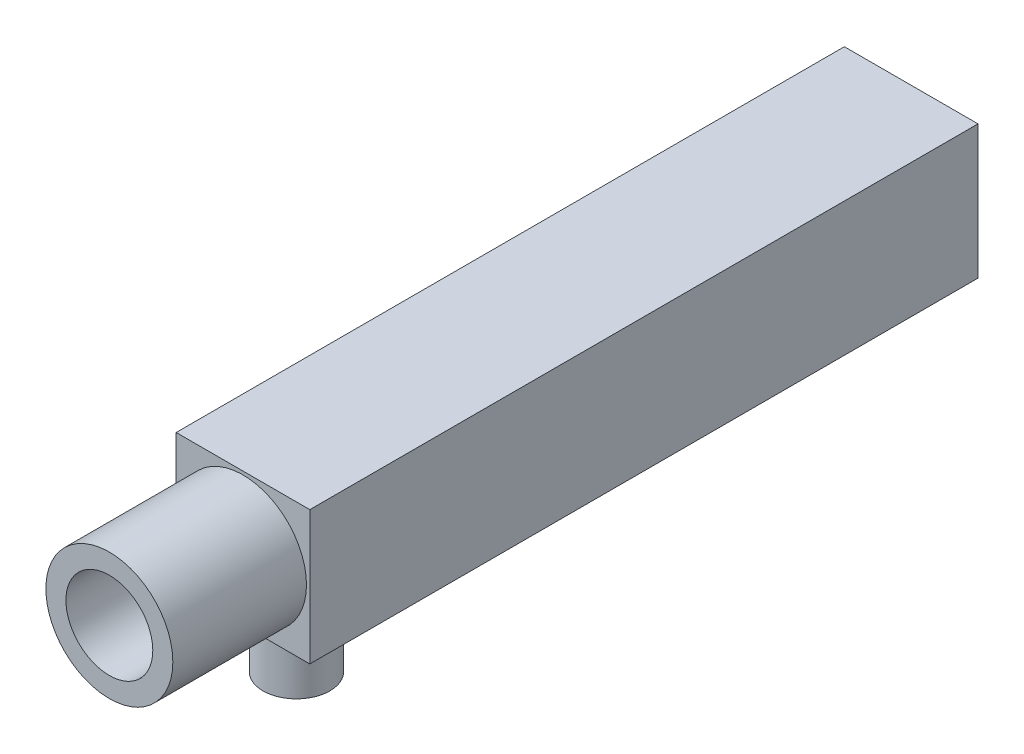
ISO-10303-21;
HEADER;
FILE_DESCRIPTION(('STEP AP214'),'2;1');
FILE_NAME('part.step','',(''),(''),'','','');
FILE_SCHEMA(('AUTOMOTIVE_DESIGN { 1 0 10303 214 1 1 1 1 }'));
ENDSEC;
DATA;
#1=APPLICATION_CONTEXT('core data for automotive mechanical design processes');
#2=APPLICATION_PROTOCOL_DEFINITION('international standard','automotive_design',2000,#1);
#3=PRODUCT_CONTEXT('',#1,'mechanical');
#4=PRODUCT('Part','Part','',(#3));
#5=PRODUCT_RELATED_PRODUCT_CATEGORY('part','',(#4));
#6=PRODUCT_DEFINITION_FORMATION('','',#4);
#7=PRODUCT_DEFINITION_CONTEXT('part definition',#1,'design');
#8=PRODUCT_DEFINITION('design','',#6,#7);
#9=PRODUCT_DEFINITION_SHAPE('','',#8);
#10=(LENGTH_UNIT() NAMED_UNIT(*) SI_UNIT(.MILLI.,.METRE.));
#11=(NAMED_UNIT(*) PLANE_ANGLE_UNIT() SI_UNIT($,.RADIAN.));
#12=(NAMED_UNIT(*) SI_UNIT($,.STERADIAN.) SOLID_ANGLE_UNIT());
#13=UNCERTAINTY_MEASURE_WITH_UNIT(LENGTH_MEASURE(1.E-05),#10,'distance_accuracy_value','');
#14=(GEOMETRIC_REPRESENTATION_CONTEXT(3) GLOBAL_UNCERTAINTY_ASSIGNED_CONTEXT((#13)) GLOBAL_UNIT_ASSIGNED_CONTEXT((#10,
#11,#12)) REPRESENTATION_CONTEXT('',''));
#15=CARTESIAN_POINT('',(0.,0.,0.));
#16=DIRECTION('',(0.,0.,1.));
#17=DIRECTION('',(1.,0.,0.));
#18=AXIS2_PLACEMENT_3D('',#15,#16,#17);
#19=CARTESIAN_POINT('',(0.,0.,45.));
#20=DIRECTION('',(0.,0.,-1.));
#21=DIRECTION('',(-1.,0.,0.));
#22=AXIS2_PLACEMENT_3D('',#19,#20,#21);
#23=PLANE('',#22);
#24=DIRECTION('',(0.,1.,0.));
#25=VECTOR('',#24,1.);
#26=CARTESIAN_POINT('',(-1.5,1.5,45.));
#27=LINE('',#26,#25);
#28=CARTESIAN_POINT('',(-1.5,6.93649167310371,45.));
#29=VERTEX_POINT('',#28);
#30=CARTESIAN_POINT('',(-1.5,8.5,45.));
#31=VERTEX_POINT('',#30);
#32=EDGE_CURVE('E148',#29,#31,#27,.T.);
#33=ORIENTED_EDGE('',*,*,#32,.F.);
#34=CARTESIAN_POINT('',(-5.,5.,45.));
#35=DIRECTION('',(0.,0.,1.));
#36=DIRECTION('',(1.,0.,0.));
#37=AXIS2_PLACEMENT_3D('',#34,#35,#36);
#38=CIRCLE('',#37,4.);
#39=CARTESIAN_POINT('',(-3.06350832689629,8.5,45.));
#40=VERTEX_POINT('',#39);
#41=EDGE_CURVE('E136',#29,#40,#38,.T.);
#42=ORIENTED_EDGE('',*,*,#41,.T.);
#43=DIRECTION('',(-1.,0.,0.));
#44=VECTOR('',#43,1.);
#45=CARTESIAN_POINT('',(-8.5,8.5,45.));
#46=LINE('',#45,#44);
#47=EDGE_CURVE('E149',#31,#40,#46,.T.);
#48=ORIENTED_EDGE('',*,*,#47,.F.);
#49=EDGE_LOOP('',(#33,#42,#48));
#50=FACE_BOUND('',#49,.T.);
#51=ADVANCED_FACE('F39',(#50),#23,.T.);
#52=CARTESIAN_POINT('',(-6.93649167310371,8.5,45.));
#53=VERTEX_POINT('',#52);
#54=CARTESIAN_POINT('',(-8.5,8.5,45.));
#55=VERTEX_POINT('',#54);
#56=EDGE_CURVE('E162',#53,#55,#46,.T.);
#57=ORIENTED_EDGE('',*,*,#56,.F.);
#58=CARTESIAN_POINT('',(-8.5,6.93649167310371,45.));
#59=VERTEX_POINT('',#58);
#60=EDGE_CURVE('E317',#53,#59,#38,.T.);
#61=ORIENTED_EDGE('',*,*,#60,.T.);
#62=DIRECTION('',(0.,-1.,0.));
#63=VECTOR('',#62,1.);
#64=CARTESIAN_POINT('',(-8.5,1.5,45.));
#65=LINE('',#64,#63);
#66=EDGE_CURVE('E301',#55,#59,#65,.T.);
#67=ORIENTED_EDGE('',*,*,#66,.F.);
#68=EDGE_LOOP('',(#57,#61,#67));
#69=FACE_BOUND('',#68,.T.);
#70=ADVANCED_FACE('F269',(#69),#23,.T.);
#71=CARTESIAN_POINT('',(-8.5,3.06350832689629,45.));
#72=VERTEX_POINT('',#71);
#73=CARTESIAN_POINT('',(-8.5,1.5,45.));
#74=VERTEX_POINT('',#73);
#75=EDGE_CURVE('E63',#72,#74,#65,.T.);
#76=ORIENTED_EDGE('',*,*,#75,.F.);
#77=CARTESIAN_POINT('',(-6.93649167310371,1.5,45.));
#78=VERTEX_POINT('',#77);
#79=EDGE_CURVE('E323',#72,#78,#38,.T.);
#80=ORIENTED_EDGE('',*,*,#79,.T.);
#81=DIRECTION('',(1.,0.,0.));
#82=VECTOR('',#81,1.);
#83=CARTESIAN_POINT('',(-8.5,1.5,45.));
#84=LINE('',#83,#82);
#85=EDGE_CURVE('E153',#74,#78,#84,.T.);
#86=ORIENTED_EDGE('',*,*,#85,.F.);
#87=EDGE_LOOP('',(#76,#80,#86));
#88=FACE_BOUND('',#87,.T.);
#89=ADVANCED_FACE('F259',(#88),#23,.T.);
#90=CARTESIAN_POINT('',(0.,0.,50.));
#91=DIRECTION('',(0.,0.,1.));
#92=DIRECTION('',(1.,0.,0.));
#93=AXIS2_PLACEMENT_3D('',#90,#91,#92);
#94=PLANE('',#93);
#95=CARTESIAN_POINT('',(-5.,5.,50.));
#96=DIRECTION('',(0.,0.,1.));
#97=DIRECTION('',(1.,0.,0.));
#98=AXIS2_PLACEMENT_3D('',#95,#96,#97);
#99=CIRCLE('',#98,4.75);
#100=CARTESIAN_POINT('',(-0.25,5.,50.));
#101=VERTEX_POINT('',#100);
#102=EDGE_CURVE('E347',#101,#101,#99,.T.);
#103=ORIENTED_EDGE('',*,*,#102,.F.);
#104=EDGE_LOOP('',(#103));
#105=FACE_BOUND('',#104,.T.);
#106=DIRECTION('',(0.,1.,0.));
#107=VECTOR('',#106,1.);
#108=CARTESIAN_POINT('',(0.,0.,50.));
#109=LINE('',#108,#107);
#110=CARTESIAN_POINT('',(0.,0.,50.));
#111=VERTEX_POINT('',#110);
#112=CARTESIAN_POINT('',(0.,10.,50.));
#113=VERTEX_POINT('',#112);
#114=EDGE_CURVE('E198',#111,#113,#109,.T.);
#115=ORIENTED_EDGE('',*,*,#114,.T.);
#116=DIRECTION('',(-1.,0.,0.));
#117=VECTOR('',#116,1.);
#118=CARTESIAN_POINT('',(0.,10.,50.));
#119=LINE('',#118,#117);
#120=CARTESIAN_POINT('',(-10.,10.,50.));
#121=VERTEX_POINT('',#120);
#122=EDGE_CURVE('E202',#113,#121,#119,.T.);
#123=ORIENTED_EDGE('',*,*,#122,.T.);
#124=DIRECTION('',(0.,-1.,0.));
#125=VECTOR('',#124,1.);
#126=CARTESIAN_POINT('',(-10.,0.,50.));
#127=LINE('',#126,#125);
#128=CARTESIAN_POINT('',(-10.,0.,50.));
#129=VERTEX_POINT('',#128);
#130=EDGE_CURVE('E206',#121,#129,#127,.T.);
#131=ORIENTED_EDGE('',*,*,#130,.T.);
#132=DIRECTION('',(1.,0.,0.));
#133=VECTOR('',#132,1.);
#134=CARTESIAN_POINT('',(0.,0.,50.));
#135=LINE('',#134,#133);
#136=EDGE_CURVE('E209',#129,#111,#135,.T.);
#137=ORIENTED_EDGE('',*,*,#136,.T.);
#138=EDGE_LOOP('',(#115,#123,#131,#137));
#139=FACE_BOUND('',#138,.T.);
#140=ADVANCED_FACE('F257',(#105,#139),#94,.T.);
#141=CARTESIAN_POINT('',(0.,0.,0.));
#142=DIRECTION('',(0.,0.,1.));
#143=DIRECTION('',(1.,0.,0.));
#144=AXIS2_PLACEMENT_3D('',#141,#142,#143);
#145=PLANE('',#144);
#146=DIRECTION('',(0.,1.,0.));
#147=VECTOR('',#146,1.);
#148=CARTESIAN_POINT('',(0.,0.,0.));
#149=LINE('',#148,#147);
#150=CARTESIAN_POINT('',(0.,0.,0.));
#151=VERTEX_POINT('',#150);
#152=CARTESIAN_POINT('',(0.,10.,0.));
#153=VERTEX_POINT('',#152);
#154=EDGE_CURVE('E197',#151,#153,#149,.T.);
#155=ORIENTED_EDGE('',*,*,#154,.F.);
#156=DIRECTION('',(1.,0.,0.));
#157=VECTOR('',#156,1.);
#158=CARTESIAN_POINT('',(0.,0.,0.));
#159=LINE('',#158,#157);
#160=CARTESIAN_POINT('',(-10.,0.,0.));
#161=VERTEX_POINT('',#160);
#162=EDGE_CURVE('E203',#161,#151,#159,.T.);
#163=ORIENTED_EDGE('',*,*,#162,.F.);
#164=DIRECTION('',(0.,-1.,0.));
#165=VECTOR('',#164,1.);
#166=CARTESIAN_POINT('',(-10.,0.,0.));
#167=LINE('',#166,#165);
#168=CARTESIAN_POINT('',(-10.,10.,0.));
#169=VERTEX_POINT('',#168);
#170=EDGE_CURVE('E219',#169,#161,#167,.T.);
#171=ORIENTED_EDGE('',*,*,#170,.F.);
#172=DIRECTION('',(-1.,0.,0.));
#173=VECTOR('',#172,1.);
#174=CARTESIAN_POINT('',(0.,10.,0.));
#175=LINE('',#174,#173);
#176=EDGE_CURVE('E216',#153,#169,#175,.T.);
#177=ORIENTED_EDGE('',*,*,#176,.F.);
#178=EDGE_LOOP('',(#155,#163,#171,#177));
#179=FACE_BOUND('',#178,.T.);
#180=DIRECTION('',(0.,-1.,0.));
#181=VECTOR('',#180,1.);
#182=CARTESIAN_POINT('',(-8.5,8.5,0.));
#183=LINE('',#182,#181);
#184=CARTESIAN_POINT('',(-8.5,8.5,0.));
#185=VERTEX_POINT('',#184);
#186=CARTESIAN_POINT('',(-8.5,1.5,0.));
#187=VERTEX_POINT('',#186);
#188=EDGE_CURVE('E168',#185,#187,#183,.T.);
#189=ORIENTED_EDGE('',*,*,#188,.T.);
#190=DIRECTION('',(1.,0.,0.));
#191=VECTOR('',#190,1.);
#192=CARTESIAN_POINT('',(-8.5,1.5,0.));
#193=LINE('',#192,#191);
#194=CARTESIAN_POINT('',(-1.5,1.5,0.));
#195=VERTEX_POINT('',#194);
#196=EDGE_CURVE('E173',#187,#195,#193,.T.);
#197=ORIENTED_EDGE('',*,*,#196,.T.);
#198=DIRECTION('',(0.,1.,0.));
#199=VECTOR('',#198,1.);
#200=CARTESIAN_POINT('',(-1.5,8.5,0.));
#201=LINE('',#200,#199);
#202=CARTESIAN_POINT('',(-1.5,8.5,0.));
#203=VERTEX_POINT('',#202);
#204=EDGE_CURVE('E177',#195,#203,#201,.T.);
#205=ORIENTED_EDGE('',*,*,#204,.T.);
#206=DIRECTION('',(-1.,0.,0.));
#207=VECTOR('',#206,1.);
#208=CARTESIAN_POINT('',(-8.5,8.5,0.));
#209=LINE('',#208,#207);
#210=EDGE_CURVE('E181',#203,#185,#209,.T.);
#211=ORIENTED_EDGE('',*,*,#210,.T.);
#212=EDGE_LOOP('',(#189,#197,#205,#211));
#213=FACE_BOUND('',#212,.T.);
#214=ADVANCED_FACE('F246',(#179,#213),#145,.F.);
#215=CARTESIAN_POINT('',(0.,0.,50.));
#216=DIRECTION('',(-1.,0.,0.));
#217=DIRECTION('',(0.,-1.,0.));
#218=AXIS2_PLACEMENT_3D('',#215,#216,#217);
#219=PLANE('',#218);
#220=ORIENTED_EDGE('',*,*,#154,.T.);
#221=DIRECTION('',(0.,0.,-1.));
#222=VECTOR('',#221,1.);
#223=CARTESIAN_POINT('',(0.,10.,50.));
#224=LINE('',#223,#222);
#225=EDGE_CURVE('E48',#113,#153,#224,.T.);
#226=ORIENTED_EDGE('',*,*,#225,.F.);
#227=ORIENTED_EDGE('',*,*,#114,.F.);
#228=DIRECTION('',(0.,0.,-1.));
#229=VECTOR('',#228,1.);
#230=CARTESIAN_POINT('',(0.,0.,50.));
#231=LINE('',#230,#229);
#232=EDGE_CURVE('E212',#111,#151,#231,.T.);
#233=ORIENTED_EDGE('',*,*,#232,.T.);
#234=EDGE_LOOP('',(#220,#226,#227,#233));
#235=FACE_BOUND('',#234,.T.);
#236=ADVANCED_FACE('F41',(#235),#219,.F.);
#237=CARTESIAN_POINT('',(0.,10.,50.));
#238=DIRECTION('',(0.,-1.,0.));
#239=DIRECTION('',(1.,0.,0.));
#240=AXIS2_PLACEMENT_3D('',#237,#238,#239);
#241=PLANE('',#240);
#242=ORIENTED_EDGE('',*,*,#176,.T.);
#243=DIRECTION('',(0.,0.,-1.));
#244=VECTOR('',#243,1.);
#245=CARTESIAN_POINT('',(-10.,10.,50.));
#246=LINE('',#245,#244);
#247=EDGE_CURVE('E231',#121,#169,#246,.T.);
#248=ORIENTED_EDGE('',*,*,#247,.F.);
#249=ORIENTED_EDGE('',*,*,#122,.F.);
#250=ORIENTED_EDGE('',*,*,#225,.T.);
#251=EDGE_LOOP('',(#242,#248,#249,#250));
#252=FACE_BOUND('',#251,.T.);
#253=ADVANCED_FACE('F238',(#252),#241,.F.);
#254=CARTESIAN_POINT('',(-10.,0.,50.));
#255=DIRECTION('',(1.,0.,0.));
#256=DIRECTION('',(0.,0.,-1.));
#257=AXIS2_PLACEMENT_3D('',#254,#255,#256);
#258=PLANE('',#257);
#259=ORIENTED_EDGE('',*,*,#170,.T.);
#260=DIRECTION('',(0.,0.,-1.));
#261=VECTOR('',#260,1.);
#262=CARTESIAN_POINT('',(-10.,0.,50.));
#263=LINE('',#262,#261);
#264=EDGE_CURVE('E227',#129,#161,#263,.T.);
#265=ORIENTED_EDGE('',*,*,#264,.F.);
#266=ORIENTED_EDGE('',*,*,#130,.F.);
#267=ORIENTED_EDGE('',*,*,#247,.T.);
#268=EDGE_LOOP('',(#259,#265,#266,#267));
#269=FACE_BOUND('',#268,.T.);
#270=ADVANCED_FACE('F251',(#269),#258,.F.);
#271=CARTESIAN_POINT('',(0.,0.,50.));
#272=DIRECTION('',(0.,1.,0.));
#273=DIRECTION('',(-1.,0.,0.));
#274=AXIS2_PLACEMENT_3D('',#271,#272,#273);
#275=PLANE('',#274);
#276=CARTESIAN_POINT('',(-5.,0.,46.));
#277=DIRECTION('',(0.,1.,0.));
#278=DIRECTION('',(-1.,0.,0.));
#279=AXIS2_PLACEMENT_3D('',#276,#277,#278);
#280=CIRCLE('',#279,2.5);
#281=CARTESIAN_POINT('',(-7.5,0.,46.));
#282=VERTEX_POINT('',#281);
#283=EDGE_CURVE('E11',#282,#282,#280,.F.);
#284=ORIENTED_EDGE('',*,*,#283,.F.);
#285=EDGE_LOOP('',(#284));
#286=FACE_BOUND('',#285,.T.);
#287=ORIENTED_EDGE('',*,*,#162,.T.);
#288=ORIENTED_EDGE('',*,*,#232,.F.);
#289=ORIENTED_EDGE('',*,*,#136,.F.);
#290=ORIENTED_EDGE('',*,*,#264,.T.);
#291=EDGE_LOOP('',(#287,#288,#289,#290));
#292=FACE_BOUND('',#291,.T.);
#293=ADVANCED_FACE('F255',(#286,#292),#275,.F.);
#294=CARTESIAN_POINT('',(-8.5,8.5,50.));
#295=DIRECTION('',(1.,0.,0.));
#296=DIRECTION('',(0.,1.,0.));
#297=AXIS2_PLACEMENT_3D('',#294,#295,#296);
#298=PLANE('',#297);
#299=ORIENTED_EDGE('',*,*,#66,.T.);
#300=EDGE_CURVE('E313',#59,#72,#65,.T.);
#301=ORIENTED_EDGE('',*,*,#300,.T.);
#302=ORIENTED_EDGE('',*,*,#75,.T.);
#303=DIRECTION('',(0.,0.,-1.));
#304=VECTOR('',#303,1.);
#305=CARTESIAN_POINT('',(-8.5,1.5,50.));
#306=LINE('',#305,#304);
#307=EDGE_CURVE('E194',#74,#187,#306,.T.);
#308=ORIENTED_EDGE('',*,*,#307,.T.);
#309=ORIENTED_EDGE('',*,*,#188,.F.);
#310=DIRECTION('',(0.,0.,-1.));
#311=VECTOR('',#310,1.);
#312=CARTESIAN_POINT('',(-8.5,8.5,50.));
#313=LINE('',#312,#311);
#314=EDGE_CURVE('E185',#55,#185,#313,.T.);
#315=ORIENTED_EDGE('',*,*,#314,.F.);
#316=EDGE_LOOP('',(#299,#301,#302,#308,#309,#315));
#317=FACE_BOUND('',#316,.T.);
#318=ADVANCED_FACE('F415',(#317),#298,.T.);
#319=CARTESIAN_POINT('',(-8.5,1.5,50.));
#320=DIRECTION('',(0.,1.,0.));
#321=DIRECTION('',(0.,0.,1.));
#322=AXIS2_PLACEMENT_3D('',#319,#320,#321);
#323=PLANE('',#322);
#324=ORIENTED_EDGE('',*,*,#85,.T.);
#325=CARTESIAN_POINT('',(-3.06350832689629,1.5,45.));
#326=VERTEX_POINT('',#325);
#327=EDGE_CURVE('E300',#78,#326,#84,.T.);
#328=ORIENTED_EDGE('',*,*,#327,.T.);
#329=CARTESIAN_POINT('',(-1.5,1.5,45.));
#330=VERTEX_POINT('',#329);
#331=EDGE_CURVE('E296',#326,#330,#84,.T.);
#332=ORIENTED_EDGE('',*,*,#331,.T.);
#333=DIRECTION('',(0.,0.,-1.));
#334=VECTOR('',#333,1.);
#335=CARTESIAN_POINT('',(-1.5,1.5,50.));
#336=LINE('',#335,#334);
#337=EDGE_CURVE('E191',#330,#195,#336,.T.);
#338=ORIENTED_EDGE('',*,*,#337,.T.);
#339=ORIENTED_EDGE('',*,*,#196,.F.);
#340=ORIENTED_EDGE('',*,*,#307,.F.);
#341=EDGE_LOOP('',(#324,#328,#332,#338,#339,#340));
#342=FACE_BOUND('',#341,.T.);
#343=ADVANCED_FACE('F303',(#342),#323,.T.);
#344=CARTESIAN_POINT('',(-1.5,8.5,50.));
#345=DIRECTION('',(-1.,0.,0.));
#346=DIRECTION('',(0.,0.,1.));
#347=AXIS2_PLACEMENT_3D('',#344,#345,#346);
#348=PLANE('',#347);
#349=CARTESIAN_POINT('',(-1.5,3.06350832689629,45.));
#350=VERTEX_POINT('',#349);
#351=EDGE_CURVE('E155',#330,#350,#27,.T.);
#352=ORIENTED_EDGE('',*,*,#351,.T.);
#353=EDGE_CURVE('E130',#350,#29,#27,.T.);
#354=ORIENTED_EDGE('',*,*,#353,.T.);
#355=ORIENTED_EDGE('',*,*,#32,.T.);
#356=DIRECTION('',(0.,0.,-1.));
#357=VECTOR('',#356,1.);
#358=CARTESIAN_POINT('',(-1.5,8.5,50.));
#359=LINE('',#358,#357);
#360=EDGE_CURVE('E188',#31,#203,#359,.T.);
#361=ORIENTED_EDGE('',*,*,#360,.T.);
#362=ORIENTED_EDGE('',*,*,#204,.F.);
#363=ORIENTED_EDGE('',*,*,#337,.F.);
#364=EDGE_LOOP('',(#352,#354,#355,#361,#362,#363));
#365=FACE_BOUND('',#364,.T.);
#366=ADVANCED_FACE('F157',(#365),#348,.T.);
#367=CARTESIAN_POINT('',(-8.5,8.5,50.));
#368=DIRECTION('',(0.,-1.,0.));
#369=DIRECTION('',(0.,0.,-1.));
#370=AXIS2_PLACEMENT_3D('',#367,#368,#369);
#371=PLANE('',#370);
#372=ORIENTED_EDGE('',*,*,#47,.T.);
#373=EDGE_CURVE('E169',#40,#53,#46,.T.);
#374=ORIENTED_EDGE('',*,*,#373,.T.);
#375=ORIENTED_EDGE('',*,*,#56,.T.);
#376=ORIENTED_EDGE('',*,*,#314,.T.);
#377=ORIENTED_EDGE('',*,*,#210,.F.);
#378=ORIENTED_EDGE('',*,*,#360,.F.);
#379=EDGE_LOOP('',(#372,#374,#375,#376,#377,#378));
#380=FACE_BOUND('',#379,.T.);
#381=ADVANCED_FACE('F284',(#380),#371,.T.);
#382=ORIENTED_EDGE('',*,*,#331,.F.);
#383=EDGE_CURVE('E133',#326,#350,#38,.T.);
#384=ORIENTED_EDGE('',*,*,#383,.T.);
#385=ORIENTED_EDGE('',*,*,#351,.F.);
#386=EDGE_LOOP('',(#382,#384,#385));
#387=FACE_BOUND('',#386,.T.);
#388=ADVANCED_FACE('F272',(#387),#23,.T.);
#389=CARTESIAN_POINT('',(-5.,5.,45.));
#390=DIRECTION('',(0.,0.,1.));
#391=DIRECTION('',(1.,0.,0.));
#392=AXIS2_PLACEMENT_3D('',#389,#390,#391);
#393=PLANE('',#392);
#394=EDGE_CURVE('E320',#59,#72,#38,.T.);
#395=ORIENTED_EDGE('',*,*,#394,.T.);
#396=ORIENTED_EDGE('',*,*,#300,.F.);
#397=EDGE_LOOP('',(#395,#396));
#398=FACE_BOUND('',#397,.T.);
#399=ADVANCED_FACE('F283',(#398),#393,.T.);
#400=EDGE_CURVE('E143',#40,#53,#38,.T.);
#401=ORIENTED_EDGE('',*,*,#400,.T.);
#402=ORIENTED_EDGE('',*,*,#373,.F.);
#403=EDGE_LOOP('',(#401,#402));
#404=FACE_BOUND('',#403,.T.);
#405=ADVANCED_FACE('F290',(#404),#393,.T.);
#406=EDGE_CURVE('E55',#350,#29,#38,.T.);
#407=ORIENTED_EDGE('',*,*,#406,.T.);
#408=ORIENTED_EDGE('',*,*,#353,.F.);
#409=EDGE_LOOP('',(#407,#408));
#410=FACE_BOUND('',#409,.T.);
#411=ADVANCED_FACE('F128',(#410),#393,.T.);
#412=CARTESIAN_POINT('',(-5.,5.,45.));
#413=DIRECTION('',(0.,0.,1.));
#414=DIRECTION('',(1.,0.,0.));
#415=AXIS2_PLACEMENT_3D('',#412,#413,#414);
#416=CYLINDRICAL_SURFACE('',#415,4.);
#417=ORIENTED_EDGE('',*,*,#41,.F.);
#418=ORIENTED_EDGE('',*,*,#406,.F.);
#419=ORIENTED_EDGE('',*,*,#383,.F.);
#420=EDGE_CURVE('E326',#78,#326,#38,.T.);
#421=ORIENTED_EDGE('',*,*,#420,.F.);
#422=ORIENTED_EDGE('',*,*,#79,.F.);
#423=ORIENTED_EDGE('',*,*,#394,.F.);
#424=ORIENTED_EDGE('',*,*,#60,.F.);
#425=ORIENTED_EDGE('',*,*,#400,.F.);
#426=EDGE_LOOP('',(#417,#418,#419,#421,#422,#423,#424,#425));
#427=FACE_BOUND('',#426,.T.);
#428=CARTESIAN_POINT('',(-5.,5.,50.));
#429=DIRECTION('',(0.,0.,1.));
#430=DIRECTION('',(1.,0.,0.));
#431=AXIS2_PLACEMENT_3D('',#428,#429,#430);
#432=CIRCLE('',#431,4.);
#433=CARTESIAN_POINT('',(-1.,5.,50.));
#434=VERTEX_POINT('',#433);
#435=EDGE_CURVE('E339',#434,#434,#432,.F.);
#436=ORIENTED_EDGE('',*,*,#435,.F.);
#437=EDGE_LOOP('',(#436));
#438=FACE_BOUND('',#437,.T.);
#439=ADVANCED_FACE('F140',(#427,#438),#416,.F.);
#440=ORIENTED_EDGE('',*,*,#420,.T.);
#441=ORIENTED_EDGE('',*,*,#327,.F.);
#442=EDGE_LOOP('',(#440,#441));
#443=FACE_BOUND('',#442,.T.);
#444=ADVANCED_FACE('F293',(#443),#393,.T.);
#445=CARTESIAN_POINT('',(-5.,-5.,46.));
#446=DIRECTION('',(0.,-1.,0.));
#447=DIRECTION('',(1.,0.,0.));
#448=AXIS2_PLACEMENT_3D('',#445,#446,#447);
#449=PLANE('',#448);
#450=CARTESIAN_POINT('',(-5.,-5.,46.));
#451=DIRECTION('',(0.,-1.,0.));
#452=DIRECTION('',(1.,0.,0.));
#453=AXIS2_PLACEMENT_3D('',#450,#451,#452);
#454=CIRCLE('',#453,2.5);
#455=CARTESIAN_POINT('',(-2.5,-5.,46.));
#456=VERTEX_POINT('',#455);
#457=EDGE_CURVE('E134',#456,#456,#454,.T.);
#458=ORIENTED_EDGE('',*,*,#457,.T.);
#459=EDGE_LOOP('',(#458));
#460=FACE_BOUND('',#459,.T.);
#461=CARTESIAN_POINT('',(-5.,-5.,46.));
#462=DIRECTION('',(0.,-1.,0.));
#463=DIRECTION('',(1.,0.,0.));
#464=AXIS2_PLACEMENT_3D('',#461,#462,#463);
#465=CIRCLE('',#464,0.500000000000002);
#466=CARTESIAN_POINT('',(-4.5,-5.,46.));
#467=VERTEX_POINT('',#466);
#468=EDGE_CURVE('E331',#467,#467,#465,.T.);
#469=ORIENTED_EDGE('',*,*,#468,.F.);
#470=EDGE_LOOP('',(#469));
#471=FACE_BOUND('',#470,.T.);
#472=ADVANCED_FACE('F387',(#460,#471),#449,.T.);
#473=CARTESIAN_POINT('',(-5.,-5.,46.));
#474=DIRECTION('',(0.,1.,0.));
#475=DIRECTION('',(-1.,0.,0.));
#476=AXIS2_PLACEMENT_3D('',#473,#474,#475);
#477=CYLINDRICAL_SURFACE('',#476,2.5);
#478=ORIENTED_EDGE('',*,*,#457,.F.);
#479=EDGE_LOOP('',(#478));
#480=FACE_BOUND('',#479,.T.);
#481=ORIENTED_EDGE('',*,*,#283,.T.);
#482=EDGE_LOOP('',(#481));
#483=FACE_BOUND('',#482,.T.);
#484=ADVANCED_FACE('F385',(#480,#483),#477,.T.);
#485=CARTESIAN_POINT('',(-5.,-5.,46.));
#486=DIRECTION('',(0.,1.,0.));
#487=DIRECTION('',(-1.,0.,0.));
#488=AXIS2_PLACEMENT_3D('',#485,#486,#487);
#489=CYLINDRICAL_SURFACE('',#488,0.500000000000002);
#490=ORIENTED_EDGE('',*,*,#468,.T.);
#491=EDGE_LOOP('',(#490));
#492=FACE_BOUND('',#491,.T.);
#493=CARTESIAN_POINT('',(-5.,0.,46.));
#494=DIRECTION('',(0.,-1.,0.));
#495=DIRECTION('',(1.,0.,0.));
#496=AXIS2_PLACEMENT_3D('',#493,#494,#495);
#497=CIRCLE('',#496,0.500000000000002);
#498=CARTESIAN_POINT('',(-4.5,0.,46.));
#499=VERTEX_POINT('',#498);
#500=EDGE_CURVE('E335',#499,#499,#497,.T.);
#501=ORIENTED_EDGE('',*,*,#500,.F.);
#502=EDGE_LOOP('',(#501));
#503=FACE_BOUND('',#502,.T.);
#504=ADVANCED_FACE('F382',(#492,#503),#489,.F.);
#505=ORIENTED_EDGE('',*,*,#500,.T.);
#506=EDGE_LOOP('',(#505));
#507=FACE_BOUND('',#506,.T.);
#508=ADVANCED_FACE('F380',(#507),#275,.F.);
#509=CARTESIAN_POINT('',(-5.,5.,50.));
#510=DIRECTION('',(0.,0.,1.));
#511=DIRECTION('',(1.,0.,0.));
#512=AXIS2_PLACEMENT_3D('',#509,#510,#511);
#513=PLANE('',#512);
#514=CARTESIAN_POINT('',(-5.,5.,50.));
#515=DIRECTION('',(0.,0.,1.));
#516=DIRECTION('',(1.,0.,0.));
#517=AXIS2_PLACEMENT_3D('',#514,#515,#516);
#518=CIRCLE('',#517,3.25);
#519=CARTESIAN_POINT('',(-1.75,5.,50.));
#520=VERTEX_POINT('',#519);
#521=EDGE_CURVE('E355',#520,#520,#518,.T.);
#522=ORIENTED_EDGE('',*,*,#521,.T.);
#523=EDGE_LOOP('',(#522));
#524=FACE_BOUND('',#523,.T.);
#525=ORIENTED_EDGE('',*,*,#435,.T.);
#526=EDGE_LOOP('',(#525));
#527=FACE_BOUND('',#526,.T.);
#528=ADVANCED_FACE('F361',(#524,#527),#513,.F.);
#529=CARTESIAN_POINT('',(-5.,5.,60.));
#530=DIRECTION('',(0.,0.,1.));
#531=DIRECTION('',(1.,0.,0.));
#532=AXIS2_PLACEMENT_3D('',#529,#530,#531);
#533=PLANE('',#532);
#534=CARTESIAN_POINT('',(-5.,5.,60.));
#535=DIRECTION('',(0.,0.,1.));
#536=DIRECTION('',(1.,0.,0.));
#537=AXIS2_PLACEMENT_3D('',#534,#535,#536);
#538=CIRCLE('',#537,4.75);
#539=CARTESIAN_POINT('',(-0.25,5.,60.));
#540=VERTEX_POINT('',#539);
#541=EDGE_CURVE('E343',#540,#540,#538,.T.);
#542=ORIENTED_EDGE('',*,*,#541,.T.);
#543=EDGE_LOOP('',(#542));
#544=FACE_BOUND('',#543,.T.);
#545=CARTESIAN_POINT('',(-5.,5.,60.));
#546=DIRECTION('',(0.,0.,1.));
#547=DIRECTION('',(1.,0.,0.));
#548=AXIS2_PLACEMENT_3D('',#545,#546,#547);
#549=CIRCLE('',#548,3.25);
#550=CARTESIAN_POINT('',(-1.75,5.,60.));
#551=VERTEX_POINT('',#550);
#552=EDGE_CURVE('E351',#551,#551,#549,.T.);
#553=ORIENTED_EDGE('',*,*,#552,.F.);
#554=EDGE_LOOP('',(#553));
#555=FACE_BOUND('',#554,.T.);
#556=ADVANCED_FACE('F372',(#544,#555),#533,.T.);
#557=CARTESIAN_POINT('',(-5.,5.,60.));
#558=DIRECTION('',(0.,0.,-1.));
#559=DIRECTION('',(-1.,0.,0.));
#560=AXIS2_PLACEMENT_3D('',#557,#558,#559);
#561=CYLINDRICAL_SURFACE('',#560,4.75);
#562=ORIENTED_EDGE('',*,*,#541,.F.);
#563=EDGE_LOOP('',(#562));
#564=FACE_BOUND('',#563,.T.);
#565=ORIENTED_EDGE('',*,*,#102,.T.);
#566=EDGE_LOOP('',(#565));
#567=FACE_BOUND('',#566,.T.);
#568=ADVANCED_FACE('F366',(#564,#567),#561,.T.);
#569=CARTESIAN_POINT('',(-5.,5.,60.));
#570=DIRECTION('',(0.,0.,-1.));
#571=DIRECTION('',(-1.,0.,0.));
#572=AXIS2_PLACEMENT_3D('',#569,#570,#571);
#573=CYLINDRICAL_SURFACE('',#572,3.25);
#574=ORIENTED_EDGE('',*,*,#552,.T.);
#575=EDGE_LOOP('',(#574));
#576=FACE_BOUND('',#575,.T.);
#577=ORIENTED_EDGE('',*,*,#521,.F.);
#578=EDGE_LOOP('',(#577));
#579=FACE_BOUND('',#578,.T.);
#580=ADVANCED_FACE('F364',(#576,#579),#573,.F.);
#581=CLOSED_SHELL('',(#51,#70,#89,#140,#214,#236,#253,#270,#293,#318,#343,#366,#381,#388,#399,
#405,#411,#439,#444,#472,#484,#504,#508,#528,#556,#568,#580));
#582=MANIFOLD_SOLID_BREP('B2',#581);
#583=ADVANCED_BREP_SHAPE_REPRESENTATION('',(#18,#582),#14);
#584=SHAPE_DEFINITION_REPRESENTATION(#9,#583);
ENDSEC;
END-ISO-10303-21;
